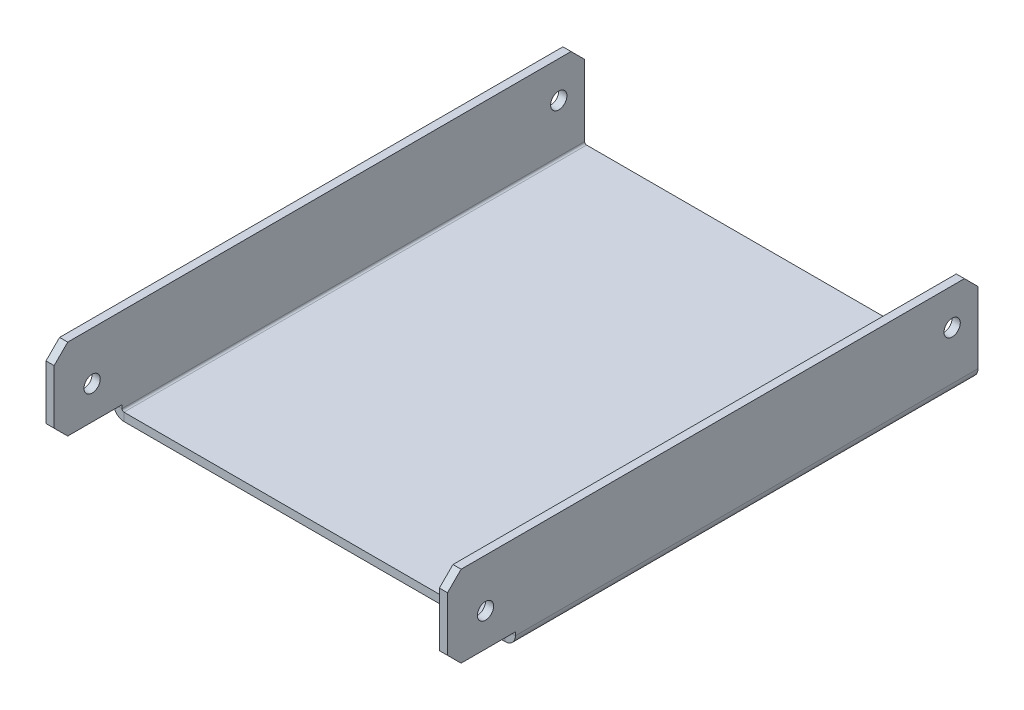
ISO-10303-21;
HEADER;
FILE_DESCRIPTION(('STEP AP214'),'2;1');
FILE_NAME('part.step','',(''),(''),'','','');
FILE_SCHEMA(('AUTOMOTIVE_DESIGN { 1 0 10303 214 1 1 1 1 }'));
ENDSEC;
DATA;
#1=APPLICATION_CONTEXT('core data for automotive mechanical design processes');
#2=APPLICATION_PROTOCOL_DEFINITION('international standard','automotive_design',2000,#1);
#3=PRODUCT_CONTEXT('',#1,'mechanical');
#4=PRODUCT('Part','Part','',(#3));
#5=PRODUCT_RELATED_PRODUCT_CATEGORY('part','',(#4));
#6=PRODUCT_DEFINITION_FORMATION('','',#4);
#7=PRODUCT_DEFINITION_CONTEXT('part definition',#1,'design');
#8=PRODUCT_DEFINITION('design','',#6,#7);
#9=PRODUCT_DEFINITION_SHAPE('','',#8);
#10=(LENGTH_UNIT() NAMED_UNIT(*) SI_UNIT(.MILLI.,.METRE.));
#11=(NAMED_UNIT(*) PLANE_ANGLE_UNIT() SI_UNIT($,.RADIAN.));
#12=(NAMED_UNIT(*) SI_UNIT($,.STERADIAN.) SOLID_ANGLE_UNIT());
#13=UNCERTAINTY_MEASURE_WITH_UNIT(LENGTH_MEASURE(1.E-05),#10,'distance_accuracy_value','');
#14=(GEOMETRIC_REPRESENTATION_CONTEXT(3) GLOBAL_UNCERTAINTY_ASSIGNED_CONTEXT((#13)) GLOBAL_UNIT_ASSIGNED_CONTEXT((#10,
#11,#12)) REPRESENTATION_CONTEXT('',''));
#15=CARTESIAN_POINT('',(0.,0.,0.));
#16=DIRECTION('',(0.,0.,1.));
#17=DIRECTION('',(1.,0.,0.));
#18=AXIS2_PLACEMENT_3D('',#15,#16,#17);
#19=CARTESIAN_POINT('',(0.,0.,-29.1965119300641));
#20=DIRECTION('',(0.,0.,-1.));
#21=DIRECTION('',(0.,1.,0.));
#22=AXIS2_PLACEMENT_3D('',#19,#20,#21);
#23=PLANE('',#22);
#24=DIRECTION('',(0.,1.,0.));
#25=VECTOR('',#24,1.);
#26=CARTESIAN_POINT('',(-3.,0.,-29.1965119300641));
#27=LINE('',#26,#25);
#28=CARTESIAN_POINT('',(-3.,0.736599999999997,-29.1965119300641));
#29=VERTEX_POINT('',#28);
#30=CARTESIAN_POINT('',(-2.99999999999991,27.,-29.1965119300641));
#31=VERTEX_POINT('',#30);
#32=EDGE_CURVE('E484',#29,#31,#27,.T.);
#33=ORIENTED_EDGE('',*,*,#32,.T.);
#34=DIRECTION('',(1.,0.,0.));
#35=VECTOR('',#34,1.);
#36=CARTESIAN_POINT('',(0.,27.,-29.1965119300641));
#37=LINE('',#36,#35);
#38=CARTESIAN_POINT('',(0.,27.,-29.1965119300641));
#39=VERTEX_POINT('',#38);
#40=EDGE_CURVE('E13',#31,#39,#37,.T.);
#41=ORIENTED_EDGE('',*,*,#40,.T.);
#42=DIRECTION('',(0.,1.,0.));
#43=VECTOR('',#42,1.);
#44=CARTESIAN_POINT('',(0.,0.,-29.1965119300641));
#45=LINE('',#44,#43);
#46=CARTESIAN_POINT('',(0.,0.736599999999987,-29.1965119300641));
#47=VERTEX_POINT('',#46);
#48=EDGE_CURVE('E260',#47,#39,#45,.T.);
#49=ORIENTED_EDGE('',*,*,#48,.F.);
#50=DIRECTION('',(-1.,0.,0.));
#51=VECTOR('',#50,1.);
#52=CARTESIAN_POINT('',(0.,0.736599999999987,-29.1965119300641));
#53=LINE('',#52,#51);
#54=EDGE_CURVE('E247',#47,#29,#53,.T.);
#55=ORIENTED_EDGE('',*,*,#54,.T.);
#56=EDGE_LOOP('',(#33,#41,#49,#55));
#57=FACE_BOUND('',#56,.T.);
#58=ADVANCED_FACE('F82',(#57),#23,.T.);
#59=DIRECTION('',(1.,0.,0.));
#60=VECTOR('',#59,1.);
#61=CARTESIAN_POINT('',(0.,0.,-29.1965119300641));
#62=LINE('',#61,#60);
#63=CARTESIAN_POINT('',(-144.2634,0.,-29.1965119300641));
#64=VERTEX_POINT('',#63);
#65=CARTESIAN_POINT('',(-3.7366,0.,-29.1965119300641));
#66=VERTEX_POINT('',#65);
#67=EDGE_CURVE('E242',#64,#66,#62,.T.);
#68=ORIENTED_EDGE('',*,*,#67,.T.);
#69=DIRECTION('',(0.,-1.,0.));
#70=VECTOR('',#69,1.);
#71=CARTESIAN_POINT('',(-3.7366,0.,-29.1965119300641));
#72=LINE('',#71,#70);
#73=CARTESIAN_POINT('',(-3.7366,-3.,-29.1965119300641));
#74=VERTEX_POINT('',#73);
#75=EDGE_CURVE('E235',#66,#74,#72,.T.);
#76=ORIENTED_EDGE('',*,*,#75,.T.);
#77=DIRECTION('',(-1.,0.,0.));
#78=VECTOR('',#77,1.);
#79=CARTESIAN_POINT('',(-153.876446647041,-3.,-29.1965119300641));
#80=LINE('',#79,#78);
#81=CARTESIAN_POINT('',(-144.2634,-3.,-29.1965119300641));
#82=VERTEX_POINT('',#81);
#83=EDGE_CURVE('E239',#74,#82,#80,.T.);
#84=ORIENTED_EDGE('',*,*,#83,.T.);
#85=DIRECTION('',(0.,1.,0.));
#86=VECTOR('',#85,1.);
#87=CARTESIAN_POINT('',(-144.2634,-3.,-29.1965119300641));
#88=LINE('',#87,#86);
#89=EDGE_CURVE('E308',#82,#64,#88,.T.);
#90=ORIENTED_EDGE('',*,*,#89,.T.);
#91=EDGE_LOOP('',(#68,#76,#84,#90));
#92=FACE_BOUND('',#91,.T.);
#93=ADVANCED_FACE('F237',(#92),#23,.T.);
#94=DIRECTION('',(0.,-1.,0.));
#95=VECTOR('',#94,1.);
#96=CARTESIAN_POINT('',(-148.,-5.08758230507149E-13,-29.1965119300641));
#97=LINE('',#96,#95);
#98=CARTESIAN_POINT('',(-148.,26.9999999999999,-29.1965119300641));
#99=VERTEX_POINT('',#98);
#100=CARTESIAN_POINT('',(-148.,0.736599999999993,-29.1965119300641));
#101=VERTEX_POINT('',#100);
#102=EDGE_CURVE('E401',#99,#101,#97,.T.);
#103=ORIENTED_EDGE('',*,*,#102,.F.);
#104=DIRECTION('',(1.,0.,0.));
#105=VECTOR('',#104,1.);
#106=CARTESIAN_POINT('',(0.,27.0000000000005,-29.1965119300641));
#107=LINE('',#106,#105);
#108=CARTESIAN_POINT('',(-145.,27.,-29.1965119300641));
#109=VERTEX_POINT('',#108);
#110=EDGE_CURVE('E92',#99,#109,#107,.T.);
#111=ORIENTED_EDGE('',*,*,#110,.T.);
#112=DIRECTION('',(0.,-1.,0.));
#113=VECTOR('',#112,1.);
#114=CARTESIAN_POINT('',(-145.,-4.98283786490619E-13,-29.1965119300641));
#115=LINE('',#114,#113);
#116=CARTESIAN_POINT('',(-145.,0.736600000000004,-29.1965119300641));
#117=VERTEX_POINT('',#116);
#118=EDGE_CURVE('E271',#109,#117,#115,.T.);
#119=ORIENTED_EDGE('',*,*,#118,.T.);
#120=DIRECTION('',(-1.,0.,0.));
#121=VECTOR('',#120,1.);
#122=CARTESIAN_POINT('',(-145.,0.736600000000004,-29.1965119300641));
#123=LINE('',#122,#121);
#124=EDGE_CURVE('E248',#117,#101,#123,.T.);
#125=ORIENTED_EDGE('',*,*,#124,.T.);
#126=EDGE_LOOP('',(#103,#111,#119,#125));
#127=FACE_BOUND('',#126,.T.);
#128=ADVANCED_FACE('F399',(#127),#23,.T.);
#129=ORIENTED_EDGE('',*,*,#54,.F.);
#130=CARTESIAN_POINT('',(-3.7366,0.7366,-29.1965119300641));
#131=DIRECTION('',(0.,0.,-1.));
#132=DIRECTION('',(0.,1.,0.));
#133=AXIS2_PLACEMENT_3D('',#130,#131,#132);
#134=CIRCLE('',#133,3.7366);
#135=EDGE_CURVE('E251',#74,#47,#134,.F.);
#136=ORIENTED_EDGE('',*,*,#135,.F.);
#137=ORIENTED_EDGE('',*,*,#75,.F.);
#138=CARTESIAN_POINT('',(-3.7366,0.7366,-29.1965119300641));
#139=DIRECTION('',(0.,0.,-1.));
#140=DIRECTION('',(0.,1.,0.));
#141=AXIS2_PLACEMENT_3D('',#138,#139,#140);
#142=CIRCLE('',#141,0.7366);
#143=EDGE_CURVE('E472',#66,#29,#142,.F.);
#144=ORIENTED_EDGE('',*,*,#143,.T.);
#145=EDGE_LOOP('',(#129,#136,#137,#144));
#146=FACE_BOUND('',#145,.T.);
#147=ADVANCED_FACE('F252',(#146),#23,.T.);
#148=CARTESIAN_POINT('',(0.,-3.,0.));
#149=DIRECTION('',(0.,-1.,0.));
#150=DIRECTION('',(0.,0.,-1.));
#151=AXIS2_PLACEMENT_3D('',#148,#149,#150);
#152=PLANE('',#151);
#153=DIRECTION('',(0.,0.,1.));
#154=VECTOR('',#153,1.);
#155=CARTESIAN_POINT('',(-144.2634,-3.,166.336888069935));
#156=LINE('',#155,#154);
#157=CARTESIAN_POINT('',(-144.2634,-3.,141.336888069935));
#158=VERTEX_POINT('',#157);
#159=EDGE_CURVE('E269',#158,#82,#156,.F.);
#160=ORIENTED_EDGE('',*,*,#159,.T.);
#161=ORIENTED_EDGE('',*,*,#83,.F.);
#162=DIRECTION('',(0.,0.,-1.));
#163=VECTOR('',#162,1.);
#164=CARTESIAN_POINT('',(-3.7366,-3.,-39.1965119300642));
#165=LINE('',#164,#163);
#166=CARTESIAN_POINT('',(-3.7366,-3.,141.336888069935));
#167=VERTEX_POINT('',#166);
#168=EDGE_CURVE('E266',#74,#167,#165,.F.);
#169=ORIENTED_EDGE('',*,*,#168,.T.);
#170=DIRECTION('',(1.,0.,0.));
#171=VECTOR('',#170,1.);
#172=CARTESIAN_POINT('',(0.,-3.,141.336888069935));
#173=LINE('',#172,#171);
#174=EDGE_CURVE('E540',#158,#167,#173,.T.);
#175=ORIENTED_EDGE('',*,*,#174,.F.);
#176=EDGE_LOOP('',(#160,#161,#169,#175));
#177=FACE_BOUND('',#176,.T.);
#178=ADVANCED_FACE('F264',(#177),#152,.T.);
#179=CARTESIAN_POINT('',(0.,0.,0.));
#180=DIRECTION('',(0.,-1.,0.));
#181=DIRECTION('',(0.,0.,-1.));
#182=AXIS2_PLACEMENT_3D('',#179,#180,#181);
#183=PLANE('',#182);
#184=ORIENTED_EDGE('',*,*,#67,.F.);
#185=DIRECTION('',(0.,0.,1.));
#186=VECTOR('',#185,1.);
#187=CARTESIAN_POINT('',(-144.2634,0.,166.336888069935));
#188=LINE('',#187,#186);
#189=CARTESIAN_POINT('',(-144.2634,0.,141.336888069935));
#190=VERTEX_POINT('',#189);
#191=EDGE_CURVE('E429',#190,#64,#188,.F.);
#192=ORIENTED_EDGE('',*,*,#191,.F.);
#193=DIRECTION('',(1.,0.,0.));
#194=VECTOR('',#193,1.);
#195=CARTESIAN_POINT('',(0.,0.,141.336888069935));
#196=LINE('',#195,#194);
#197=CARTESIAN_POINT('',(-3.7366,0.,141.336888069935));
#198=VERTEX_POINT('',#197);
#199=EDGE_CURVE('E524',#190,#198,#196,.T.);
#200=ORIENTED_EDGE('',*,*,#199,.T.);
#201=DIRECTION('',(0.,0.,-1.));
#202=VECTOR('',#201,1.);
#203=CARTESIAN_POINT('',(-3.7366,0.,-39.1965119300642));
#204=LINE('',#203,#202);
#205=EDGE_CURVE('E279',#66,#198,#204,.F.);
#206=ORIENTED_EDGE('',*,*,#205,.F.);
#207=EDGE_LOOP('',(#184,#192,#200,#206));
#208=FACE_BOUND('',#207,.T.);
#209=ADVANCED_FACE('F619',(#208),#183,.F.);
#210=CARTESIAN_POINT('',(-3.7366,0.7366,-39.1965119300642));
#211=DIRECTION('',(0.,0.,-1.));
#212=DIRECTION('',(1.,0.,0.));
#213=AXIS2_PLACEMENT_3D('',#210,#211,#212);
#214=CYLINDRICAL_SURFACE('',#213,3.7366);
#215=ORIENTED_EDGE('',*,*,#168,.F.);
#216=ORIENTED_EDGE('',*,*,#135,.T.);
#217=DIRECTION('',(0.,0.,-1.));
#218=VECTOR('',#217,1.);
#219=CARTESIAN_POINT('',(0.,0.736599999999987,0.));
#220=LINE('',#219,#218);
#221=CARTESIAN_POINT('',(0.,0.736599999999987,141.336888069935));
#222=VERTEX_POINT('',#221);
#223=EDGE_CURVE('E461',#222,#47,#220,.T.);
#224=ORIENTED_EDGE('',*,*,#223,.F.);
#225=CARTESIAN_POINT('',(-3.7366,0.7366,141.336888069935));
#226=DIRECTION('',(0.,0.,-1.));
#227=DIRECTION('',(-1.,0.,0.));
#228=AXIS2_PLACEMENT_3D('',#225,#226,#227);
#229=CIRCLE('',#228,3.7366);
#230=EDGE_CURVE('E276',#167,#222,#229,.F.);
#231=ORIENTED_EDGE('',*,*,#230,.F.);
#232=EDGE_LOOP('',(#215,#216,#224,#231));
#233=FACE_BOUND('',#232,.T.);
#234=ADVANCED_FACE('F274',(#233),#214,.T.);
#235=CARTESIAN_POINT('',(-3.7366,0.7366,-39.1965119300642));
#236=DIRECTION('',(0.,0.,-1.));
#237=DIRECTION('',(1.,0.,0.));
#238=AXIS2_PLACEMENT_3D('',#235,#236,#237);
#239=CYLINDRICAL_SURFACE('',#238,0.7366);
#240=ORIENTED_EDGE('',*,*,#143,.F.);
#241=ORIENTED_EDGE('',*,*,#205,.T.);
#242=CARTESIAN_POINT('',(-3.7366,0.7366,141.336888069935));
#243=DIRECTION('',(0.,0.,-1.));
#244=DIRECTION('',(-1.,0.,0.));
#245=AXIS2_PLACEMENT_3D('',#242,#243,#244);
#246=CIRCLE('',#245,0.7366);
#247=CARTESIAN_POINT('',(-3.,0.736599999999997,141.336888069935));
#248=VERTEX_POINT('',#247);
#249=EDGE_CURVE('E475',#198,#248,#246,.F.);
#250=ORIENTED_EDGE('',*,*,#249,.T.);
#251=DIRECTION('',(0.,0.,1.));
#252=VECTOR('',#251,1.);
#253=CARTESIAN_POINT('',(-3.,0.736599999999997,166.336888069935));
#254=LINE('',#253,#252);
#255=EDGE_CURVE('E289',#248,#29,#254,.F.);
#256=ORIENTED_EDGE('',*,*,#255,.T.);
#257=EDGE_LOOP('',(#240,#241,#250,#256));
#258=FACE_BOUND('',#257,.T.);
#259=ADVANCED_FACE('F471',(#258),#239,.F.);
#260=CARTESIAN_POINT('',(0.,0.,0.));
#261=DIRECTION('',(1.,0.,0.));
#262=DIRECTION('',(0.,1.,0.));
#263=AXIS2_PLACEMENT_3D('',#260,#261,#262);
#264=PLANE('',#263);
#265=CARTESIAN_POINT('',(1.94289029309402E-13,14.2300000000006,152.336888069935));
#266=DIRECTION('',(-1.,0.,0.));
#267=DIRECTION('',(0.,-1.,0.));
#268=AXIS2_PLACEMENT_3D('',#265,#266,#267);
#269=CIRCLE('',#268,2.99999999999999);
#270=CARTESIAN_POINT('',(2.05541289694117E-13,11.2300000000006,152.336888069935));
#271=VERTEX_POINT('',#270);
#272=EDGE_CURVE('E314',#271,#271,#269,.T.);
#273=ORIENTED_EDGE('',*,*,#272,.T.);
#274=EDGE_LOOP('',(#273));
#275=FACE_BOUND('',#274,.T.);
#276=CARTESIAN_POINT('',(1.66533453693773E-13,18.6400000000006,-19.6665119300642));
#277=DIRECTION('',(-1.,0.,0.));
#278=DIRECTION('',(0.,-1.,0.));
#279=AXIS2_PLACEMENT_3D('',#276,#277,#278);
#280=CIRCLE('',#279,3.);
#281=CARTESIAN_POINT('',(1.77785714078488E-13,15.6400000000006,-19.6665119300642));
#282=VERTEX_POINT('',#281);
#283=EDGE_CURVE('E502',#282,#282,#280,.T.);
#284=ORIENTED_EDGE('',*,*,#283,.T.);
#285=EDGE_LOOP('',(#284));
#286=FACE_BOUND('',#285,.T.);
#287=DIRECTION('',(0.,1.,0.));
#288=VECTOR('',#287,1.);
#289=CARTESIAN_POINT('',(1.11889664200504E-13,32.,166.336888069935));
#290=LINE('',#289,#288);
#291=CARTESIAN_POINT('',(0.,6.99999999999997,166.336888069935));
#292=VERTEX_POINT('',#291);
#293=CARTESIAN_POINT('',(0.,27.,166.336888069935));
#294=VERTEX_POINT('',#293);
#295=EDGE_CURVE('E450',#292,#294,#290,.T.);
#296=ORIENTED_EDGE('',*,*,#295,.F.);
#297=DIRECTION('',(0.,-0.707106781186548,-0.707106781186548));
#298=VECTOR('',#297,1.);
#299=CARTESIAN_POINT('',(-2.78160885642758E-13,-79.6684440349677,79.6684440349677));
#300=LINE('',#299,#298);
#301=CARTESIAN_POINT('',(0.,2.,161.336888069935));
#302=VERTEX_POINT('',#301);
#303=EDGE_CURVE('E353',#292,#302,#300,.T.);
#304=ORIENTED_EDGE('',*,*,#303,.T.);
#305=DIRECTION('',(0.,0.,1.));
#306=VECTOR('',#305,1.);
#307=CARTESIAN_POINT('',(0.,2.,0.));
#308=LINE('',#307,#306);
#309=CARTESIAN_POINT('',(0.,2.,141.336888069935));
#310=VERTEX_POINT('',#309);
#311=EDGE_CURVE('E441',#310,#302,#308,.T.);
#312=ORIENTED_EDGE('',*,*,#311,.F.);
#313=DIRECTION('',(0.,1.,0.));
#314=VECTOR('',#313,1.);
#315=CARTESIAN_POINT('',(0.,0.,141.336888069935));
#316=LINE('',#315,#314);
#317=EDGE_CURVE('E546',#222,#310,#316,.T.);
#318=ORIENTED_EDGE('',*,*,#317,.F.);
#319=ORIENTED_EDGE('',*,*,#223,.T.);
#320=ORIENTED_EDGE('',*,*,#48,.T.);
#321=DIRECTION('',(0.,-0.707106781186549,-0.707106781186546));
#322=VECTOR('',#321,1.);
#323=CARTESIAN_POINT('',(0.,28.098255965032,-28.0982559650321));
#324=LINE('',#323,#322);
#325=CARTESIAN_POINT('',(1.11889664200504E-13,32.,-24.1965119300641));
#326=VERTEX_POINT('',#325);
#327=EDGE_CURVE('E347',#39,#326,#324,.F.);
#328=ORIENTED_EDGE('',*,*,#327,.T.);
#329=DIRECTION('',(0.,0.,-1.));
#330=VECTOR('',#329,1.);
#331=CARTESIAN_POINT('',(1.11889664200504E-13,32.,-39.1965119300641));
#332=LINE('',#331,#330);
#333=CARTESIAN_POINT('',(1.11889664200504E-13,32.,161.336888069935));
#334=VERTEX_POINT('',#333);
#335=EDGE_CURVE('E286',#334,#326,#332,.T.);
#336=ORIENTED_EDGE('',*,*,#335,.F.);
#337=DIRECTION('',(0.,0.707106781186546,-0.707106781186549));
#338=VECTOR('',#337,1.);
#339=CARTESIAN_POINT('',(3.37516068403092E-13,96.6684440349677,96.6684440349672));
#340=LINE('',#339,#338);
#341=EDGE_CURVE('E350',#334,#294,#340,.F.);
#342=ORIENTED_EDGE('',*,*,#341,.T.);
#343=EDGE_LOOP('',(#296,#304,#312,#318,#319,#320,#328,#336,#342));
#344=FACE_BOUND('',#343,.T.);
#345=ADVANCED_FACE('F582',(#275,#286,#344),#264,.T.);
#346=CARTESIAN_POINT('',(-3.,0.,0.));
#347=DIRECTION('',(1.,0.,0.));
#348=DIRECTION('',(0.,1.,0.));
#349=AXIS2_PLACEMENT_3D('',#346,#347,#348);
#350=PLANE('',#349);
#351=CARTESIAN_POINT('',(-2.99999999999994,18.6400000000005,-19.6665119300642));
#352=DIRECTION('',(1.,0.,0.));
#353=DIRECTION('',(0.,1.,0.));
#354=AXIS2_PLACEMENT_3D('',#351,#352,#353);
#355=CIRCLE('',#354,3.);
#356=CARTESIAN_POINT('',(-2.99999999999992,21.6400000000005,-19.6665119300642));
#357=VERTEX_POINT('',#356);
#358=EDGE_CURVE('E313',#357,#357,#355,.T.);
#359=ORIENTED_EDGE('',*,*,#358,.T.);
#360=EDGE_LOOP('',(#359));
#361=FACE_BOUND('',#360,.T.);
#362=CARTESIAN_POINT('',(-2.99999999999995,14.2300000000005,152.336888069935));
#363=DIRECTION('',(1.,0.,0.));
#364=DIRECTION('',(0.,1.,0.));
#365=AXIS2_PLACEMENT_3D('',#362,#363,#364);
#366=CIRCLE('',#365,2.99999999999999);
#367=CARTESIAN_POINT('',(-2.99999999999994,17.2300000000005,152.336888069935));
#368=VERTEX_POINT('',#367);
#369=EDGE_CURVE('E319',#368,#368,#366,.T.);
#370=ORIENTED_EDGE('',*,*,#369,.T.);
#371=EDGE_LOOP('',(#370));
#372=FACE_BOUND('',#371,.T.);
#373=DIRECTION('',(0.,0.,1.));
#374=VECTOR('',#373,1.);
#375=CARTESIAN_POINT('',(-2.99999999999999,2.,0.));
#376=LINE('',#375,#374);
#377=CARTESIAN_POINT('',(-3.,2.,141.336888069935));
#378=VERTEX_POINT('',#377);
#379=CARTESIAN_POINT('',(-2.99999999999999,2.,161.336888069935));
#380=VERTEX_POINT('',#379);
#381=EDGE_CURVE('E552',#378,#380,#376,.T.);
#382=ORIENTED_EDGE('',*,*,#381,.T.);
#383=DIRECTION('',(0.,0.707106781186548,0.707106781186548));
#384=VECTOR('',#383,1.);
#385=CARTESIAN_POINT('',(-3.,1.99999999999975,161.336888069935));
#386=LINE('',#385,#384);
#387=CARTESIAN_POINT('',(-2.99999999999998,6.99999999999997,166.336888069935));
#388=VERTEX_POINT('',#387);
#389=EDGE_CURVE('E337',#380,#388,#386,.T.);
#390=ORIENTED_EDGE('',*,*,#389,.T.);
#391=DIRECTION('',(0.,-1.,0.));
#392=VECTOR('',#391,1.);
#393=CARTESIAN_POINT('',(-3.,1.44274252327922E-13,166.336888069935));
#394=LINE('',#393,#392);
#395=CARTESIAN_POINT('',(-2.99999999999991,27.,166.336888069935));
#396=VERTEX_POINT('',#395);
#397=EDGE_CURVE('E458',#388,#396,#394,.F.);
#398=ORIENTED_EDGE('',*,*,#397,.T.);
#399=DIRECTION('',(0.,-0.707106781186546,0.707106781186549));
#400=VECTOR('',#399,1.);
#401=CARTESIAN_POINT('',(-2.99999999999991,27.,166.336888069935));
#402=LINE('',#401,#400);
#403=CARTESIAN_POINT('',(-2.99999999999989,32.,161.336888069935));
#404=VERTEX_POINT('',#403);
#405=EDGE_CURVE('E334',#396,#404,#402,.F.);
#406=ORIENTED_EDGE('',*,*,#405,.T.);
#407=DIRECTION('',(0.,0.,1.));
#408=VECTOR('',#407,1.);
#409=CARTESIAN_POINT('',(-2.99999999999989,32.,0.));
#410=LINE('',#409,#408);
#411=CARTESIAN_POINT('',(-2.99999999999989,32.,-24.1965119300641));
#412=VERTEX_POINT('',#411);
#413=EDGE_CURVE('E454',#404,#412,#410,.F.);
#414=ORIENTED_EDGE('',*,*,#413,.T.);
#415=DIRECTION('',(0.,0.707106781186549,0.707106781186546));
#416=VECTOR('',#415,1.);
#417=CARTESIAN_POINT('',(-2.99999999999989,32.,-24.1965119300641));
#418=LINE('',#417,#416);
#419=EDGE_CURVE('E331',#412,#31,#418,.F.);
#420=ORIENTED_EDGE('',*,*,#419,.T.);
#421=ORIENTED_EDGE('',*,*,#32,.F.);
#422=ORIENTED_EDGE('',*,*,#255,.F.);
#423=DIRECTION('',(0.,1.,0.));
#424=VECTOR('',#423,1.);
#425=CARTESIAN_POINT('',(-3.,0.,141.336888069935));
#426=LINE('',#425,#424);
#427=EDGE_CURVE('E482',#248,#378,#426,.T.);
#428=ORIENTED_EDGE('',*,*,#427,.T.);
#429=EDGE_LOOP('',(#382,#390,#398,#406,#414,#420,#421,#422,#428));
#430=FACE_BOUND('',#429,.T.);
#431=ADVANCED_FACE('F480',(#361,#372,#430),#350,.F.);
#432=CARTESIAN_POINT('',(1.11889664200504E-13,32.,-39.1965119300641));
#433=DIRECTION('',(0.,1.,0.));
#434=DIRECTION('',(-1.,0.,0.));
#435=AXIS2_PLACEMENT_3D('',#432,#433,#434);
#436=PLANE('',#435);
#437=ORIENTED_EDGE('',*,*,#413,.F.);
#438=DIRECTION('',(1.,0.,0.));
#439=VECTOR('',#438,1.);
#440=CARTESIAN_POINT('',(1.11889664200504E-13,32.,161.336888069935));
#441=LINE('',#440,#439);
#442=EDGE_CURVE('E386',#404,#334,#441,.T.);
#443=ORIENTED_EDGE('',*,*,#442,.T.);
#444=ORIENTED_EDGE('',*,*,#335,.T.);
#445=DIRECTION('',(-1.,0.,0.));
#446=VECTOR('',#445,1.);
#447=CARTESIAN_POINT('',(1.11889664200504E-13,32.,-24.1965119300641));
#448=LINE('',#447,#446);
#449=EDGE_CURVE('E382',#326,#412,#448,.T.);
#450=ORIENTED_EDGE('',*,*,#449,.T.);
#451=EDGE_LOOP('',(#437,#443,#444,#450));
#452=FACE_BOUND('',#451,.T.);
#453=ADVANCED_FACE('F577',(#452),#436,.T.);
#454=CARTESIAN_POINT('',(-144.2634,0.736600000000006,166.336888069935));
#455=DIRECTION('',(0.,0.,1.));
#456=DIRECTION('',(-1.,0.,0.));
#457=AXIS2_PLACEMENT_3D('',#454,#455,#456);
#458=CYLINDRICAL_SURFACE('',#457,3.7366);
#459=DIRECTION('',(0.,0.,1.));
#460=VECTOR('',#459,1.);
#461=CARTESIAN_POINT('',(-148.,0.736599999999993,0.));
#462=LINE('',#461,#460);
#463=CARTESIAN_POINT('',(-148.,0.736599999999993,141.336888069935));
#464=VERTEX_POINT('',#463);
#465=EDGE_CURVE('E436',#101,#464,#462,.T.);
#466=ORIENTED_EDGE('',*,*,#465,.F.);
#467=CARTESIAN_POINT('',(-144.2634,0.736600000000006,-29.1965119300641));
#468=DIRECTION('',(0.,0.,-1.));
#469=DIRECTION('',(0.,1.,0.));
#470=AXIS2_PLACEMENT_3D('',#467,#468,#469);
#471=CIRCLE('',#470,3.7366);
#472=EDGE_CURVE('E982',#101,#82,#471,.F.);
#473=ORIENTED_EDGE('',*,*,#472,.T.);
#474=ORIENTED_EDGE('',*,*,#159,.F.);
#475=CARTESIAN_POINT('',(-144.2634,0.736600000000006,141.336888069935));
#476=DIRECTION('',(0.,0.,-1.));
#477=DIRECTION('',(-1.,0.,0.));
#478=AXIS2_PLACEMENT_3D('',#475,#476,#477);
#479=CIRCLE('',#478,3.7366);
#480=EDGE_CURVE('E536',#464,#158,#479,.F.);
#481=ORIENTED_EDGE('',*,*,#480,.F.);
#482=EDGE_LOOP('',(#466,#473,#474,#481));
#483=FACE_BOUND('',#482,.T.);
#484=ADVANCED_FACE('F675',(#483),#458,.T.);
#485=CARTESIAN_POINT('',(-144.2634,0.736600000000006,166.336888069935));
#486=DIRECTION('',(0.,0.,1.));
#487=DIRECTION('',(-1.,0.,0.));
#488=AXIS2_PLACEMENT_3D('',#485,#486,#487);
#489=CYLINDRICAL_SURFACE('',#488,0.736600000000004);
#490=CARTESIAN_POINT('',(-144.2634,0.736600000000006,-29.1965119300641));
#491=DIRECTION('',(0.,0.,-1.));
#492=DIRECTION('',(0.,1.,0.));
#493=AXIS2_PLACEMENT_3D('',#490,#491,#492);
#494=CIRCLE('',#493,0.736600000000004);
#495=EDGE_CURVE('E984',#117,#64,#494,.F.);
#496=ORIENTED_EDGE('',*,*,#495,.F.);
#497=DIRECTION('',(0.,0.,-1.));
#498=VECTOR('',#497,1.);
#499=CARTESIAN_POINT('',(-145.,0.736600000000004,-39.1965119300642));
#500=LINE('',#499,#498);
#501=CARTESIAN_POINT('',(-145.,0.736600000000004,141.336888069935));
#502=VERTEX_POINT('',#501);
#503=EDGE_CURVE('E406',#117,#502,#500,.F.);
#504=ORIENTED_EDGE('',*,*,#503,.T.);
#505=CARTESIAN_POINT('',(-144.2634,0.736600000000006,141.336888069935));
#506=DIRECTION('',(0.,0.,-1.));
#507=DIRECTION('',(-1.,0.,0.));
#508=AXIS2_PLACEMENT_3D('',#505,#506,#507);
#509=CIRCLE('',#508,0.736600000000004);
#510=EDGE_CURVE('E520',#502,#190,#509,.F.);
#511=ORIENTED_EDGE('',*,*,#510,.T.);
#512=ORIENTED_EDGE('',*,*,#191,.T.);
#513=EDGE_LOOP('',(#496,#504,#511,#512));
#514=FACE_BOUND('',#513,.T.);
#515=ADVANCED_FACE('F680',(#514),#489,.F.);
#516=CARTESIAN_POINT('',(-148.,-5.23952592905664E-13,0.));
#517=DIRECTION('',(-1.,0.,0.));
#518=DIRECTION('',(0.,-1.,0.));
#519=AXIS2_PLACEMENT_3D('',#516,#517,#518);
#520=PLANE('',#519);
#521=CARTESIAN_POINT('',(-148.,14.23,152.336888069935));
#522=DIRECTION('',(-1.,0.,0.));
#523=DIRECTION('',(0.,-1.,0.));
#524=AXIS2_PLACEMENT_3D('',#521,#522,#523);
#525=CIRCLE('',#524,2.99999999999999);
#526=CARTESIAN_POINT('',(-148.,11.23,152.336888069935));
#527=VERTEX_POINT('',#526);
#528=EDGE_CURVE('E498',#527,#527,#525,.T.);
#529=ORIENTED_EDGE('',*,*,#528,.F.);
#530=EDGE_LOOP('',(#529));
#531=FACE_BOUND('',#530,.T.);
#532=CARTESIAN_POINT('',(-148.,18.64,-19.6665119300642));
#533=DIRECTION('',(-1.,0.,0.));
#534=DIRECTION('',(0.,-1.,0.));
#535=AXIS2_PLACEMENT_3D('',#532,#533,#534);
#536=CIRCLE('',#535,3.);
#537=CARTESIAN_POINT('',(-148.,15.64,-19.6665119300642));
#538=VERTEX_POINT('',#537);
#539=EDGE_CURVE('E259',#538,#538,#536,.T.);
#540=ORIENTED_EDGE('',*,*,#539,.F.);
#541=EDGE_LOOP('',(#540));
#542=FACE_BOUND('',#541,.T.);
#543=DIRECTION('',(0.,0.,-1.));
#544=VECTOR('',#543,1.);
#545=CARTESIAN_POINT('',(-148.,2.,0.));
#546=LINE('',#545,#544);
#547=CARTESIAN_POINT('',(-148.,2.,161.336888069935));
#548=VERTEX_POINT('',#547);
#549=CARTESIAN_POINT('',(-148.,2.,141.336888069935));
#550=VERTEX_POINT('',#549);
#551=EDGE_CURVE('E549',#548,#550,#546,.T.);
#552=ORIENTED_EDGE('',*,*,#551,.F.);
#553=DIRECTION('',(0.,0.707106781186548,0.707106781186548));
#554=VECTOR('',#553,1.);
#555=CARTESIAN_POINT('',(-148.,-79.6684440349679,79.6684440349674));
#556=LINE('',#555,#554);
#557=CARTESIAN_POINT('',(-148.,6.99999999999999,166.336888069935));
#558=VERTEX_POINT('',#557);
#559=EDGE_CURVE('E366',#548,#558,#556,.T.);
#560=ORIENTED_EDGE('',*,*,#559,.T.);
#561=DIRECTION('',(0.,-1.,0.));
#562=VECTOR('',#561,1.);
#563=CARTESIAN_POINT('',(-148.,0.,166.336888069935));
#564=LINE('',#563,#562);
#565=CARTESIAN_POINT('',(-148.,26.9999999999999,166.336888069935));
#566=VERTEX_POINT('',#565);
#567=EDGE_CURVE('E423',#566,#558,#564,.T.);
#568=ORIENTED_EDGE('',*,*,#567,.F.);
#569=DIRECTION('',(0.,-0.707106781186548,0.707106781186548));
#570=VECTOR('',#569,1.);
#571=CARTESIAN_POINT('',(-148.,96.6684440349673,96.6684440349678));
#572=LINE('',#571,#570);
#573=CARTESIAN_POINT('',(-148.,32.,161.336888069935));
#574=VERTEX_POINT('',#573);
#575=EDGE_CURVE('E363',#566,#574,#572,.F.);
#576=ORIENTED_EDGE('',*,*,#575,.T.);
#577=DIRECTION('',(0.,0.,1.));
#578=VECTOR('',#577,1.);
#579=CARTESIAN_POINT('',(-148.,32.,166.336888069935));
#580=LINE('',#579,#578);
#581=CARTESIAN_POINT('',(-148.,32.,-24.1965119300641));
#582=VERTEX_POINT('',#581);
#583=EDGE_CURVE('E415',#582,#574,#580,.T.);
#584=ORIENTED_EDGE('',*,*,#583,.F.);
#585=DIRECTION('',(0.,0.707106781186548,0.707106781186547));
#586=VECTOR('',#585,1.);
#587=CARTESIAN_POINT('',(-148.,28.0982559650317,-28.0982559650323));
#588=LINE('',#587,#586);
#589=EDGE_CURVE('E360',#582,#99,#588,.F.);
#590=ORIENTED_EDGE('',*,*,#589,.T.);
#591=ORIENTED_EDGE('',*,*,#102,.T.);
#592=ORIENTED_EDGE('',*,*,#465,.T.);
#593=DIRECTION('',(0.,-1.,0.));
#594=VECTOR('',#593,1.);
#595=CARTESIAN_POINT('',(-148.,-5.23952592905664E-13,141.336888069935));
#596=LINE('',#595,#594);
#597=EDGE_CURVE('E532',#550,#464,#596,.T.);
#598=ORIENTED_EDGE('',*,*,#597,.F.);
#599=EDGE_LOOP('',(#552,#560,#568,#576,#584,#590,#591,#592,#598));
#600=FACE_BOUND('',#599,.T.);
#601=ADVANCED_FACE('F419',(#531,#542,#600),#520,.T.);
#602=CARTESIAN_POINT('',(-145.,-5.13478148889135E-13,0.));
#603=DIRECTION('',(-1.,0.,0.));
#604=DIRECTION('',(0.,-1.,0.));
#605=AXIS2_PLACEMENT_3D('',#602,#603,#604);
#606=PLANE('',#605);
#607=CARTESIAN_POINT('',(-145.,18.64,-19.6665119300642));
#608=DIRECTION('',(-1.,0.,0.));
#609=DIRECTION('',(0.,-1.,0.));
#610=AXIS2_PLACEMENT_3D('',#607,#608,#609);
#611=CIRCLE('',#610,3.);
#612=CARTESIAN_POINT('',(-145.,15.64,-19.6665119300642));
#613=VERTEX_POINT('',#612);
#614=EDGE_CURVE('E309',#613,#613,#611,.T.);
#615=ORIENTED_EDGE('',*,*,#614,.T.);
#616=EDGE_LOOP('',(#615));
#617=FACE_BOUND('',#616,.T.);
#618=CARTESIAN_POINT('',(-145.,14.23,152.336888069935));
#619=DIRECTION('',(-1.,0.,0.));
#620=DIRECTION('',(0.,-1.,0.));
#621=AXIS2_PLACEMENT_3D('',#618,#619,#620);
#622=CIRCLE('',#621,2.99999999999999);
#623=CARTESIAN_POINT('',(-145.,11.23,152.336888069935));
#624=VERTEX_POINT('',#623);
#625=EDGE_CURVE('E315',#624,#624,#622,.T.);
#626=ORIENTED_EDGE('',*,*,#625,.T.);
#627=EDGE_LOOP('',(#626));
#628=FACE_BOUND('',#627,.T.);
#629=DIRECTION('',(0.,1.,0.));
#630=VECTOR('',#629,1.);
#631=CARTESIAN_POINT('',(-145.,0.,166.336888069935));
#632=LINE('',#631,#630);
#633=CARTESIAN_POINT('',(-145.,26.9999999999999,166.336888069935));
#634=VERTEX_POINT('',#633);
#635=CARTESIAN_POINT('',(-145.,6.99999999999999,166.336888069935));
#636=VERTEX_POINT('',#635);
#637=EDGE_CURVE('E424',#634,#636,#632,.F.);
#638=ORIENTED_EDGE('',*,*,#637,.T.);
#639=DIRECTION('',(0.,-0.707106781186548,-0.707106781186548));
#640=VECTOR('',#639,1.);
#641=CARTESIAN_POINT('',(-145.,2.00000000000001,161.336888069935));
#642=LINE('',#641,#640);
#643=CARTESIAN_POINT('',(-145.,2.,161.336888069935));
#644=VERTEX_POINT('',#643);
#645=EDGE_CURVE('E379',#636,#644,#642,.T.);
#646=ORIENTED_EDGE('',*,*,#645,.T.);
#647=DIRECTION('',(0.,0.,-1.));
#648=VECTOR('',#647,1.);
#649=CARTESIAN_POINT('',(-145.,2.,0.));
#650=LINE('',#649,#648);
#651=CARTESIAN_POINT('',(-145.,2.,141.336888069935));
#652=VERTEX_POINT('',#651);
#653=EDGE_CURVE('E284',#644,#652,#650,.T.);
#654=ORIENTED_EDGE('',*,*,#653,.T.);
#655=DIRECTION('',(0.,-1.,0.));
#656=VECTOR('',#655,1.);
#657=CARTESIAN_POINT('',(-145.,-5.13478148889135E-13,141.336888069935));
#658=LINE('',#657,#656);
#659=EDGE_CURVE('E278',#652,#502,#658,.T.);
#660=ORIENTED_EDGE('',*,*,#659,.T.);
#661=ORIENTED_EDGE('',*,*,#503,.F.);
#662=ORIENTED_EDGE('',*,*,#118,.F.);
#663=DIRECTION('',(0.,-0.707106781186548,-0.707106781186547));
#664=VECTOR('',#663,1.);
#665=CARTESIAN_POINT('',(-145.,32.,-24.1965119300641));
#666=LINE('',#665,#664);
#667=CARTESIAN_POINT('',(-145.,32.,-24.1965119300641));
#668=VERTEX_POINT('',#667);
#669=EDGE_CURVE('E107',#109,#668,#666,.F.);
#670=ORIENTED_EDGE('',*,*,#669,.T.);
#671=DIRECTION('',(0.,0.,-1.));
#672=VECTOR('',#671,1.);
#673=CARTESIAN_POINT('',(-145.,32.,0.));
#674=LINE('',#673,#672);
#675=CARTESIAN_POINT('',(-145.,32.,161.336888069935));
#676=VERTEX_POINT('',#675);
#677=EDGE_CURVE('E416',#668,#676,#674,.F.);
#678=ORIENTED_EDGE('',*,*,#677,.T.);
#679=DIRECTION('',(0.,0.707106781186548,-0.707106781186548));
#680=VECTOR('',#679,1.);
#681=CARTESIAN_POINT('',(-145.,32.,161.336888069935));
#682=LINE('',#681,#680);
#683=EDGE_CURVE('E99',#676,#634,#682,.F.);
#684=ORIENTED_EDGE('',*,*,#683,.T.);
#685=EDGE_LOOP('',(#638,#646,#654,#660,#661,#662,#670,#678,#684));
#686=FACE_BOUND('',#685,.T.);
#687=ADVANCED_FACE('F405',(#617,#628,#686),#606,.F.);
#688=CARTESIAN_POINT('',(-148.,32.,166.336888069935));
#689=DIRECTION('',(0.,1.,0.));
#690=DIRECTION('',(-1.,0.,0.));
#691=AXIS2_PLACEMENT_3D('',#688,#689,#690);
#692=PLANE('',#691);
#693=ORIENTED_EDGE('',*,*,#583,.T.);
#694=DIRECTION('',(1.,0.,0.));
#695=VECTOR('',#694,1.);
#696=CARTESIAN_POINT('',(-148.,32.,161.336888069935));
#697=LINE('',#696,#695);
#698=EDGE_CURVE('E393',#574,#676,#697,.T.);
#699=ORIENTED_EDGE('',*,*,#698,.T.);
#700=ORIENTED_EDGE('',*,*,#677,.F.);
#701=DIRECTION('',(-1.,0.,0.));
#702=VECTOR('',#701,1.);
#703=CARTESIAN_POINT('',(-148.,32.,-24.1965119300641));
#704=LINE('',#703,#702);
#705=EDGE_CURVE('E389',#668,#582,#704,.T.);
#706=ORIENTED_EDGE('',*,*,#705,.T.);
#707=EDGE_LOOP('',(#693,#699,#700,#706));
#708=FACE_BOUND('',#707,.T.);
#709=ADVANCED_FACE('F414',(#708),#692,.T.);
#710=CARTESIAN_POINT('',(0.,0.,141.336888069935));
#711=DIRECTION('',(0.,0.,-1.));
#712=DIRECTION('',(-1.,0.,0.));
#713=AXIS2_PLACEMENT_3D('',#710,#711,#712);
#714=PLANE('',#713);
#715=ORIENTED_EDGE('',*,*,#597,.T.);
#716=DIRECTION('',(1.,0.,0.));
#717=VECTOR('',#716,1.);
#718=CARTESIAN_POINT('',(-148.,0.736599999999993,141.336888069935));
#719=LINE('',#718,#717);
#720=EDGE_CURVE('E304',#464,#502,#719,.T.);
#721=ORIENTED_EDGE('',*,*,#720,.T.);
#722=ORIENTED_EDGE('',*,*,#659,.F.);
#723=DIRECTION('',(-1.,0.,0.));
#724=VECTOR('',#723,1.);
#725=CARTESIAN_POINT('',(-149.,2.,141.336888069935));
#726=LINE('',#725,#724);
#727=EDGE_CURVE('E515',#652,#550,#726,.T.);
#728=ORIENTED_EDGE('',*,*,#727,.T.);
#729=EDGE_LOOP('',(#715,#721,#722,#728));
#730=FACE_BOUND('',#729,.T.);
#731=ADVANCED_FACE('F755',(#730),#714,.F.);
#732=ORIENTED_EDGE('',*,*,#199,.F.);
#733=DIRECTION('',(0.,-1.,0.));
#734=VECTOR('',#733,1.);
#735=CARTESIAN_POINT('',(-144.2634,0.,141.336888069935));
#736=LINE('',#735,#734);
#737=EDGE_CURVE('E301',#190,#158,#736,.T.);
#738=ORIENTED_EDGE('',*,*,#737,.T.);
#739=ORIENTED_EDGE('',*,*,#174,.T.);
#740=DIRECTION('',(0.,1.,0.));
#741=VECTOR('',#740,1.);
#742=CARTESIAN_POINT('',(-3.7366,-3.,141.336888069935));
#743=LINE('',#742,#741);
#744=EDGE_CURVE('E297',#167,#198,#743,.T.);
#745=ORIENTED_EDGE('',*,*,#744,.T.);
#746=EDGE_LOOP('',(#732,#738,#739,#745));
#747=FACE_BOUND('',#746,.T.);
#748=ADVANCED_FACE('F842',(#747),#714,.F.);
#749=ORIENTED_EDGE('',*,*,#720,.F.);
#750=ORIENTED_EDGE('',*,*,#480,.T.);
#751=ORIENTED_EDGE('',*,*,#737,.F.);
#752=ORIENTED_EDGE('',*,*,#510,.F.);
#753=EDGE_LOOP('',(#749,#750,#751,#752));
#754=FACE_BOUND('',#753,.T.);
#755=ADVANCED_FACE('F832',(#754),#714,.F.);
#756=ORIENTED_EDGE('',*,*,#427,.F.);
#757=DIRECTION('',(1.,0.,0.));
#758=VECTOR('',#757,1.);
#759=CARTESIAN_POINT('',(-3.,0.736599999999997,141.336888069935));
#760=LINE('',#759,#758);
#761=EDGE_CURVE('E294',#248,#222,#760,.T.);
#762=ORIENTED_EDGE('',*,*,#761,.T.);
#763=ORIENTED_EDGE('',*,*,#317,.T.);
#764=EDGE_CURVE('E519',#310,#378,#726,.T.);
#765=ORIENTED_EDGE('',*,*,#764,.T.);
#766=EDGE_LOOP('',(#756,#762,#763,#765));
#767=FACE_BOUND('',#766,.T.);
#768=ADVANCED_FACE('F802',(#767),#714,.F.);
#769=CARTESIAN_POINT('',(1.11889664200504E-13,32.,166.336888069935));
#770=DIRECTION('',(0.,0.,1.));
#771=DIRECTION('',(0.,-1.,0.));
#772=AXIS2_PLACEMENT_3D('',#769,#770,#771);
#773=PLANE('',#772);
#774=ORIENTED_EDGE('',*,*,#397,.F.);
#775=DIRECTION('',(1.,0.,0.));
#776=VECTOR('',#775,1.);
#777=CARTESIAN_POINT('',(0.,6.99999999999997,166.336888069935));
#778=LINE('',#777,#776);
#779=EDGE_CURVE('E344',#388,#292,#778,.T.);
#780=ORIENTED_EDGE('',*,*,#779,.T.);
#781=ORIENTED_EDGE('',*,*,#295,.T.);
#782=DIRECTION('',(-1.,0.,0.));
#783=VECTOR('',#782,1.);
#784=CARTESIAN_POINT('',(0.,27.,166.336888069935));
#785=LINE('',#784,#783);
#786=EDGE_CURVE('E340',#294,#396,#785,.T.);
#787=ORIENTED_EDGE('',*,*,#786,.T.);
#788=EDGE_LOOP('',(#774,#780,#781,#787));
#789=FACE_BOUND('',#788,.T.);
#790=ADVANCED_FACE('F568',(#789),#773,.T.);
#791=CARTESIAN_POINT('',(-148.,0.,166.336888069935));
#792=DIRECTION('',(0.,0.,1.));
#793=DIRECTION('',(0.,-1.,0.));
#794=AXIS2_PLACEMENT_3D('',#791,#792,#793);
#795=PLANE('',#794);
#796=ORIENTED_EDGE('',*,*,#567,.T.);
#797=DIRECTION('',(1.,0.,0.));
#798=VECTOR('',#797,1.);
#799=CARTESIAN_POINT('',(-145.,6.99999999999999,166.336888069935));
#800=LINE('',#799,#798);
#801=EDGE_CURVE('E372',#558,#636,#800,.T.);
#802=ORIENTED_EDGE('',*,*,#801,.T.);
#803=ORIENTED_EDGE('',*,*,#637,.F.);
#804=DIRECTION('',(-1.,0.,0.));
#805=VECTOR('',#804,1.);
#806=CARTESIAN_POINT('',(-148.,26.9999999999999,166.336888069935));
#807=LINE('',#806,#805);
#808=EDGE_CURVE('E369',#634,#566,#807,.T.);
#809=ORIENTED_EDGE('',*,*,#808,.T.);
#810=EDGE_LOOP('',(#796,#802,#803,#809));
#811=FACE_BOUND('',#810,.T.);
#812=ADVANCED_FACE('F823',(#811),#795,.T.);
#813=CARTESIAN_POINT('',(-149.,2.,141.336888069935));
#814=DIRECTION('',(0.,1.,0.));
#815=DIRECTION('',(0.,0.,1.));
#816=AXIS2_PLACEMENT_3D('',#813,#814,#815);
#817=PLANE('',#816);
#818=ORIENTED_EDGE('',*,*,#311,.T.);
#819=DIRECTION('',(-1.,0.,0.));
#820=VECTOR('',#819,1.);
#821=CARTESIAN_POINT('',(-3.,2.,161.336888069935));
#822=LINE('',#821,#820);
#823=EDGE_CURVE('E327',#302,#380,#822,.T.);
#824=ORIENTED_EDGE('',*,*,#823,.T.);
#825=ORIENTED_EDGE('',*,*,#381,.F.);
#826=ORIENTED_EDGE('',*,*,#764,.F.);
#827=EDGE_LOOP('',(#818,#824,#825,#826));
#828=FACE_BOUND('',#827,.T.);
#829=ADVANCED_FACE('F560',(#828),#817,.F.);
#830=ORIENTED_EDGE('',*,*,#653,.F.);
#831=DIRECTION('',(-1.,0.,0.));
#832=VECTOR('',#831,1.);
#833=CARTESIAN_POINT('',(-148.,2.,161.336888069935));
#834=LINE('',#833,#832);
#835=EDGE_CURVE('E356',#644,#548,#834,.T.);
#836=ORIENTED_EDGE('',*,*,#835,.T.);
#837=ORIENTED_EDGE('',*,*,#551,.T.);
#838=ORIENTED_EDGE('',*,*,#727,.F.);
#839=EDGE_LOOP('',(#830,#836,#837,#838));
#840=FACE_BOUND('',#839,.T.);
#841=ADVANCED_FACE('F799',(#840),#817,.F.);
#842=ORIENTED_EDGE('',*,*,#744,.F.);
#843=ORIENTED_EDGE('',*,*,#230,.T.);
#844=ORIENTED_EDGE('',*,*,#761,.F.);
#845=ORIENTED_EDGE('',*,*,#249,.F.);
#846=EDGE_LOOP('',(#842,#843,#844,#845));
#847=FACE_BOUND('',#846,.T.);
#848=ADVANCED_FACE('F789',(#847),#714,.F.);
#849=CARTESIAN_POINT('',(1.66533453693773E-13,18.6400000000006,-19.6665119300642));
#850=DIRECTION('',(-1.,0.,0.));
#851=DIRECTION('',(0.,-1.,0.));
#852=AXIS2_PLACEMENT_3D('',#849,#850,#851);
#853=CYLINDRICAL_SURFACE('',#852,3.);
#854=ORIENTED_EDGE('',*,*,#539,.T.);
#855=EDGE_LOOP('',(#854));
#856=FACE_BOUND('',#855,.T.);
#857=ORIENTED_EDGE('',*,*,#614,.F.);
#858=EDGE_LOOP('',(#857));
#859=FACE_BOUND('',#858,.T.);
#860=ADVANCED_FACE('F771',(#856,#859),#853,.F.);
#861=CARTESIAN_POINT('',(1.94289029309402E-13,14.2300000000006,152.336888069935));
#862=DIRECTION('',(-1.,0.,0.));
#863=DIRECTION('',(0.,-1.,0.));
#864=AXIS2_PLACEMENT_3D('',#861,#862,#863);
#865=CYLINDRICAL_SURFACE('',#864,2.99999999999999);
#866=ORIENTED_EDGE('',*,*,#528,.T.);
#867=EDGE_LOOP('',(#866));
#868=FACE_BOUND('',#867,.T.);
#869=ORIENTED_EDGE('',*,*,#625,.F.);
#870=EDGE_LOOP('',(#869));
#871=FACE_BOUND('',#870,.T.);
#872=ADVANCED_FACE('F613',(#868,#871),#865,.F.);
#873=ORIENTED_EDGE('',*,*,#283,.F.);
#874=EDGE_LOOP('',(#873));
#875=FACE_BOUND('',#874,.T.);
#876=ORIENTED_EDGE('',*,*,#358,.F.);
#877=EDGE_LOOP('',(#876));
#878=FACE_BOUND('',#877,.T.);
#879=ADVANCED_FACE('F611',(#875,#878),#853,.F.);
#880=ORIENTED_EDGE('',*,*,#272,.F.);
#881=EDGE_LOOP('',(#880));
#882=FACE_BOUND('',#881,.T.);
#883=ORIENTED_EDGE('',*,*,#369,.F.);
#884=EDGE_LOOP('',(#883));
#885=FACE_BOUND('',#884,.T.);
#886=ADVANCED_FACE('F603',(#882,#885),#865,.F.);
#887=ORIENTED_EDGE('',*,*,#124,.F.);
#888=ORIENTED_EDGE('',*,*,#495,.T.);
#889=ORIENTED_EDGE('',*,*,#89,.F.);
#890=ORIENTED_EDGE('',*,*,#472,.F.);
#891=EDGE_LOOP('',(#887,#888,#889,#890));
#892=FACE_BOUND('',#891,.T.);
#893=ADVANCED_FACE('F597',(#892),#23,.T.);
#894=CARTESIAN_POINT('',(-149.,2.,161.336888069935));
#895=DIRECTION('',(0.,-0.707106781186548,0.707106781186548));
#896=DIRECTION('',(1.,0.,0.));
#897=AXIS2_PLACEMENT_3D('',#894,#895,#896);
#898=PLANE('',#897);
#899=ORIENTED_EDGE('',*,*,#303,.F.);
#900=ORIENTED_EDGE('',*,*,#779,.F.);
#901=ORIENTED_EDGE('',*,*,#389,.F.);
#902=ORIENTED_EDGE('',*,*,#823,.F.);
#903=EDGE_LOOP('',(#899,#900,#901,#902));
#904=FACE_BOUND('',#903,.T.);
#905=ADVANCED_FACE('F564',(#904),#898,.T.);
#906=CARTESIAN_POINT('',(-149.,2.,161.336888069935));
#907=DIRECTION('',(0.,-0.707106781186548,0.707106781186548));
#908=DIRECTION('',(1.,0.,0.));
#909=AXIS2_PLACEMENT_3D('',#906,#907,#908);
#910=PLANE('',#909);
#911=ORIENTED_EDGE('',*,*,#645,.F.);
#912=ORIENTED_EDGE('',*,*,#801,.F.);
#913=ORIENTED_EDGE('',*,*,#559,.F.);
#914=ORIENTED_EDGE('',*,*,#835,.F.);
#915=EDGE_LOOP('',(#911,#912,#913,#914));
#916=FACE_BOUND('',#915,.T.);
#917=ADVANCED_FACE('F609',(#916),#910,.T.);
#918=CARTESIAN_POINT('',(0.,27.,166.336888069935));
#919=DIRECTION('',(0.,-0.707106781186549,-0.707106781186545));
#920=DIRECTION('',(-1.,0.,0.));
#921=AXIS2_PLACEMENT_3D('',#918,#919,#920);
#922=PLANE('',#921);
#923=ORIENTED_EDGE('',*,*,#341,.F.);
#924=ORIENTED_EDGE('',*,*,#442,.F.);
#925=ORIENTED_EDGE('',*,*,#405,.F.);
#926=ORIENTED_EDGE('',*,*,#786,.F.);
#927=EDGE_LOOP('',(#923,#924,#925,#926));
#928=FACE_BOUND('',#927,.T.);
#929=ADVANCED_FACE('F573',(#928),#922,.F.);
#930=CARTESIAN_POINT('',(-148.,32.,161.336888069935));
#931=DIRECTION('',(0.,-0.707106781186547,-0.707106781186547));
#932=DIRECTION('',(1.,0.,0.));
#933=AXIS2_PLACEMENT_3D('',#930,#931,#932);
#934=PLANE('',#933);
#935=ORIENTED_EDGE('',*,*,#575,.F.);
#936=ORIENTED_EDGE('',*,*,#808,.F.);
#937=ORIENTED_EDGE('',*,*,#683,.F.);
#938=ORIENTED_EDGE('',*,*,#698,.F.);
#939=EDGE_LOOP('',(#935,#936,#937,#938));
#940=FACE_BOUND('',#939,.T.);
#941=ADVANCED_FACE('F921',(#940),#934,.F.);
#942=CARTESIAN_POINT('',(-148.,32.,-24.1965119300641));
#943=DIRECTION('',(0.,-0.707106781186547,0.707106781186548));
#944=DIRECTION('',(-1.,0.,0.));
#945=AXIS2_PLACEMENT_3D('',#942,#943,#944);
#946=PLANE('',#945);
#947=ORIENTED_EDGE('',*,*,#669,.F.);
#948=ORIENTED_EDGE('',*,*,#110,.F.);
#949=ORIENTED_EDGE('',*,*,#589,.F.);
#950=ORIENTED_EDGE('',*,*,#705,.F.);
#951=EDGE_LOOP('',(#947,#948,#949,#950));
#952=FACE_BOUND('',#951,.T.);
#953=ADVANCED_FACE('F410',(#952),#946,.F.);
#954=CARTESIAN_POINT('',(1.11889664200504E-13,32.,-24.1965119300641));
#955=DIRECTION('',(0.,-0.707106781186545,0.707106781186549));
#956=DIRECTION('',(-1.,0.,0.));
#957=AXIS2_PLACEMENT_3D('',#954,#955,#956);
#958=PLANE('',#957);
#959=ORIENTED_EDGE('',*,*,#327,.F.);
#960=ORIENTED_EDGE('',*,*,#40,.F.);
#961=ORIENTED_EDGE('',*,*,#419,.F.);
#962=ORIENTED_EDGE('',*,*,#449,.F.);
#963=EDGE_LOOP('',(#959,#960,#961,#962));
#964=FACE_BOUND('',#963,.T.);
#965=ADVANCED_FACE('F85',(#964),#958,.F.);
#966=CLOSED_SHELL('',(#58,#93,#128,#147,#178,#209,#234,#259,#345,#431,#453,#484,#515,#601,#687,
#709,#731,#748,#755,#768,#790,#812,#829,#841,#848,#860,#872,#879,#886,#893,#905,#917,#929,#941,
#953,#965));
#967=MANIFOLD_SOLID_BREP('B2',#966);
#968=ADVANCED_BREP_SHAPE_REPRESENTATION('',(#18,#967),#14);
#969=SHAPE_DEFINITION_REPRESENTATION(#9,#968);
ENDSEC;
END-ISO-10303-21;
